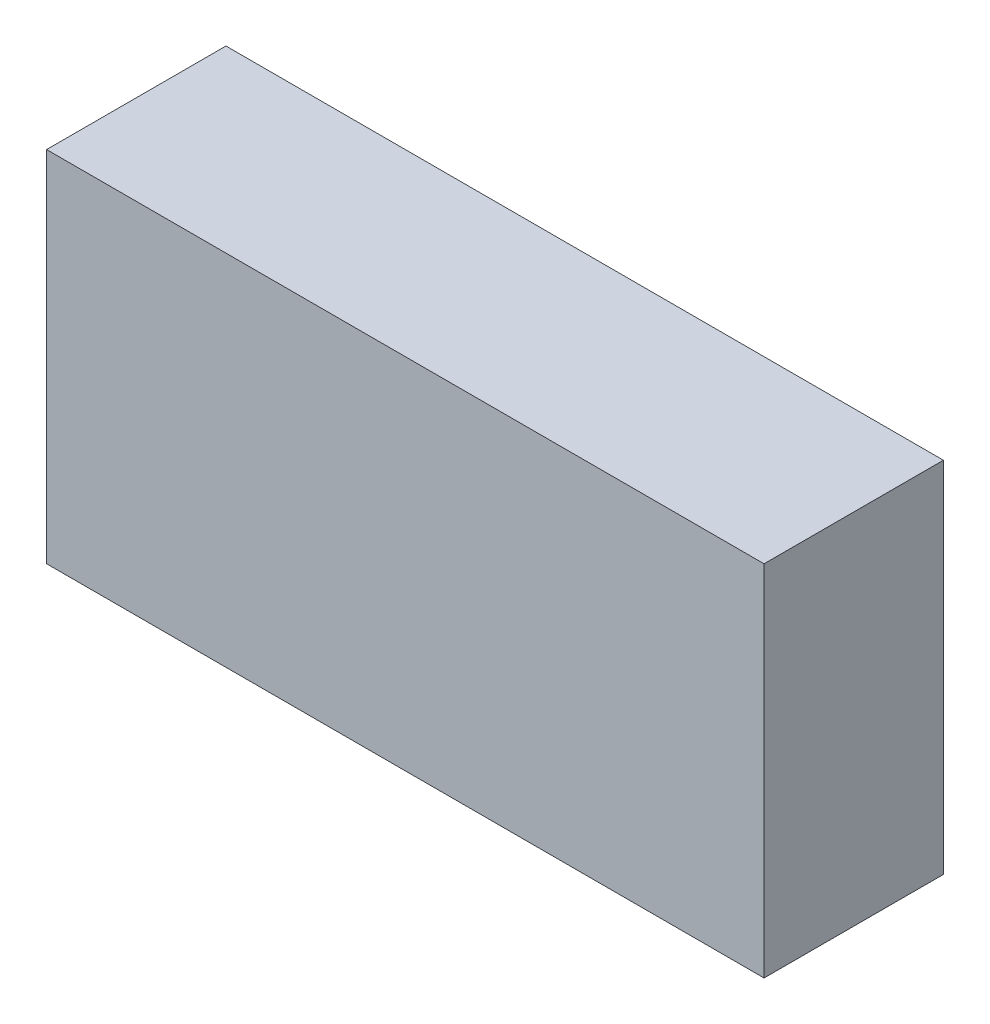
ISO-10303-21;
HEADER;
FILE_DESCRIPTION(('STEP AP214'),'2;1');
FILE_NAME('part.step','',(''),(''),'','','');
FILE_SCHEMA(('AUTOMOTIVE_DESIGN { 1 0 10303 214 1 1 1 1 }'));
ENDSEC;
DATA;
#1=APPLICATION_CONTEXT('core data for automotive mechanical design processes');
#2=APPLICATION_PROTOCOL_DEFINITION('international standard','automotive_design',2000,#1);
#3=PRODUCT_CONTEXT('',#1,'mechanical');
#4=PRODUCT('Part','Part','',(#3));
#5=PRODUCT_RELATED_PRODUCT_CATEGORY('part','',(#4));
#6=PRODUCT_DEFINITION_FORMATION('','',#4);
#7=PRODUCT_DEFINITION_CONTEXT('part definition',#1,'design');
#8=PRODUCT_DEFINITION('design','',#6,#7);
#9=PRODUCT_DEFINITION_SHAPE('','',#8);
#10=(LENGTH_UNIT() NAMED_UNIT(*) SI_UNIT(.MILLI.,.METRE.));
#11=(NAMED_UNIT(*) PLANE_ANGLE_UNIT() SI_UNIT($,.RADIAN.));
#12=(NAMED_UNIT(*) SI_UNIT($,.STERADIAN.) SOLID_ANGLE_UNIT());
#13=UNCERTAINTY_MEASURE_WITH_UNIT(LENGTH_MEASURE(1.E-05),#10,'distance_accuracy_value','');
#14=(GEOMETRIC_REPRESENTATION_CONTEXT(3) GLOBAL_UNCERTAINTY_ASSIGNED_CONTEXT((#13)) GLOBAL_UNIT_ASSIGNED_CONTEXT((#10,
#11,#12)) REPRESENTATION_CONTEXT('',''));
#15=CARTESIAN_POINT('',(0.,0.,0.));
#16=DIRECTION('',(0.,0.,1.));
#17=DIRECTION('',(1.,0.,0.));
#18=AXIS2_PLACEMENT_3D('',#15,#16,#17);
#19=CARTESIAN_POINT('',(-20.,10.,10.));
#20=DIRECTION('',(1.,0.,0.));
#21=DIRECTION('',(0.,0.,-1.));
#22=AXIS2_PLACEMENT_3D('',#19,#20,#21);
#23=PLANE('',#22);
#24=DIRECTION('',(0.,-1.,0.));
#25=VECTOR('',#24,1.);
#26=CARTESIAN_POINT('',(-20.,10.,0.));
#27=LINE('',#26,#25);
#28=CARTESIAN_POINT('',(-20.,10.,0.));
#29=VERTEX_POINT('',#28);
#30=CARTESIAN_POINT('',(-20.,-10.,0.));
#31=VERTEX_POINT('',#30);
#32=EDGE_CURVE('E101',#29,#31,#27,.T.);
#33=ORIENTED_EDGE('',*,*,#32,.T.);
#34=DIRECTION('',(0.,0.,-1.));
#35=VECTOR('',#34,1.);
#36=CARTESIAN_POINT('',(-20.,-10.,10.));
#37=LINE('',#36,#35);
#38=CARTESIAN_POINT('',(-20.,-10.,10.));
#39=VERTEX_POINT('',#38);
#40=EDGE_CURVE('E11',#39,#31,#37,.T.);
#41=ORIENTED_EDGE('',*,*,#40,.F.);
#42=DIRECTION('',(0.,-1.,0.));
#43=VECTOR('',#42,1.);
#44=CARTESIAN_POINT('',(-20.,10.,10.));
#45=LINE('',#44,#43);
#46=CARTESIAN_POINT('',(-20.,10.,10.));
#47=VERTEX_POINT('',#46);
#48=EDGE_CURVE('E95',#47,#39,#45,.T.);
#49=ORIENTED_EDGE('',*,*,#48,.F.);
#50=DIRECTION('',(0.,0.,-1.));
#51=VECTOR('',#50,1.);
#52=CARTESIAN_POINT('',(-20.,10.,10.));
#53=LINE('',#52,#51);
#54=EDGE_CURVE('E99',#47,#29,#53,.T.);
#55=ORIENTED_EDGE('',*,*,#54,.T.);
#56=EDGE_LOOP('',(#33,#41,#49,#55));
#57=FACE_BOUND('',#56,.T.);
#58=ADVANCED_FACE('F41',(#57),#23,.F.);
#59=CARTESIAN_POINT('',(-20.,-10.,10.));
#60=DIRECTION('',(0.,1.,0.));
#61=DIRECTION('',(0.,0.,1.));
#62=AXIS2_PLACEMENT_3D('',#59,#60,#61);
#63=PLANE('',#62);
#64=DIRECTION('',(1.,0.,0.));
#65=VECTOR('',#64,1.);
#66=CARTESIAN_POINT('',(-20.,-10.,0.));
#67=LINE('',#66,#65);
#68=CARTESIAN_POINT('',(20.,-10.,0.));
#69=VERTEX_POINT('',#68);
#70=EDGE_CURVE('E96',#31,#69,#67,.T.);
#71=ORIENTED_EDGE('',*,*,#70,.T.);
#72=DIRECTION('',(0.,0.,-1.));
#73=VECTOR('',#72,1.);
#74=CARTESIAN_POINT('',(20.,-10.,10.));
#75=LINE('',#74,#73);
#76=CARTESIAN_POINT('',(20.,-10.,10.));
#77=VERTEX_POINT('',#76);
#78=EDGE_CURVE('E47',#77,#69,#75,.T.);
#79=ORIENTED_EDGE('',*,*,#78,.F.);
#80=DIRECTION('',(1.,0.,0.));
#81=VECTOR('',#80,1.);
#82=CARTESIAN_POINT('',(-20.,-10.,10.));
#83=LINE('',#82,#81);
#84=EDGE_CURVE('E90',#39,#77,#83,.T.);
#85=ORIENTED_EDGE('',*,*,#84,.F.);
#86=ORIENTED_EDGE('',*,*,#40,.T.);
#87=EDGE_LOOP('',(#71,#79,#85,#86));
#88=FACE_BOUND('',#87,.T.);
#89=ADVANCED_FACE('F94',(#88),#63,.F.);
#90=CARTESIAN_POINT('',(20.,-10.,10.));
#91=DIRECTION('',(-1.,0.,0.));
#92=DIRECTION('',(0.,0.,1.));
#93=AXIS2_PLACEMENT_3D('',#90,#91,#92);
#94=PLANE('',#93);
#95=DIRECTION('',(0.,1.,0.));
#96=VECTOR('',#95,1.);
#97=CARTESIAN_POINT('',(20.,-10.,0.));
#98=LINE('',#97,#96);
#99=CARTESIAN_POINT('',(20.,10.,0.));
#100=VERTEX_POINT('',#99);
#101=EDGE_CURVE('E74',#69,#100,#98,.T.);
#102=ORIENTED_EDGE('',*,*,#101,.T.);
#103=DIRECTION('',(0.,0.,-1.));
#104=VECTOR('',#103,1.);
#105=CARTESIAN_POINT('',(20.,10.,10.));
#106=LINE('',#105,#104);
#107=CARTESIAN_POINT('',(20.,10.,10.));
#108=VERTEX_POINT('',#107);
#109=EDGE_CURVE('E100',#108,#100,#106,.T.);
#110=ORIENTED_EDGE('',*,*,#109,.F.);
#111=DIRECTION('',(0.,1.,0.));
#112=VECTOR('',#111,1.);
#113=CARTESIAN_POINT('',(20.,-10.,10.));
#114=LINE('',#113,#112);
#115=EDGE_CURVE('E89',#77,#108,#114,.T.);
#116=ORIENTED_EDGE('',*,*,#115,.F.);
#117=ORIENTED_EDGE('',*,*,#78,.T.);
#118=EDGE_LOOP('',(#102,#110,#116,#117));
#119=FACE_BOUND('',#118,.T.);
#120=ADVANCED_FACE('F97',(#119),#94,.F.);
#121=CARTESIAN_POINT('',(20.,10.,10.));
#122=DIRECTION('',(0.,-1.,0.));
#123=DIRECTION('',(0.,0.,-1.));
#124=AXIS2_PLACEMENT_3D('',#121,#122,#123);
#125=PLANE('',#124);
#126=DIRECTION('',(-1.,0.,0.));
#127=VECTOR('',#126,1.);
#128=CARTESIAN_POINT('',(20.,10.,0.));
#129=LINE('',#128,#127);
#130=EDGE_CURVE('E79',#100,#29,#129,.T.);
#131=ORIENTED_EDGE('',*,*,#130,.T.);
#132=ORIENTED_EDGE('',*,*,#54,.F.);
#133=DIRECTION('',(-1.,0.,0.));
#134=VECTOR('',#133,1.);
#135=CARTESIAN_POINT('',(20.,10.,10.));
#136=LINE('',#135,#134);
#137=EDGE_CURVE('E60',#108,#47,#136,.T.);
#138=ORIENTED_EDGE('',*,*,#137,.F.);
#139=ORIENTED_EDGE('',*,*,#109,.T.);
#140=EDGE_LOOP('',(#131,#132,#138,#139));
#141=FACE_BOUND('',#140,.T.);
#142=ADVANCED_FACE('F112',(#141),#125,.F.);
#143=CARTESIAN_POINT('',(0.,0.,10.));
#144=DIRECTION('',(0.,0.,1.));
#145=DIRECTION('',(1.,0.,0.));
#146=AXIS2_PLACEMENT_3D('',#143,#144,#145);
#147=PLANE('',#146);
#148=ORIENTED_EDGE('',*,*,#48,.T.);
#149=ORIENTED_EDGE('',*,*,#84,.T.);
#150=ORIENTED_EDGE('',*,*,#115,.T.);
#151=ORIENTED_EDGE('',*,*,#137,.T.);
#152=EDGE_LOOP('',(#148,#149,#150,#151));
#153=FACE_BOUND('',#152,.T.);
#154=ADVANCED_FACE('F88',(#153),#147,.T.);
#155=CARTESIAN_POINT('',(0.,0.,0.));
#156=DIRECTION('',(0.,0.,1.));
#157=DIRECTION('',(1.,0.,0.));
#158=AXIS2_PLACEMENT_3D('',#155,#156,#157);
#159=PLANE('',#158);
#160=ORIENTED_EDGE('',*,*,#32,.F.);
#161=ORIENTED_EDGE('',*,*,#130,.F.);
#162=ORIENTED_EDGE('',*,*,#101,.F.);
#163=ORIENTED_EDGE('',*,*,#70,.F.);
#164=EDGE_LOOP('',(#160,#161,#162,#163));
#165=FACE_BOUND('',#164,.T.);
#166=ADVANCED_FACE('F114',(#165),#159,.F.);
#167=CLOSED_SHELL('',(#58,#89,#120,#142,#154,#166));
#168=MANIFOLD_SOLID_BREP('B2',#167);
#169=ADVANCED_BREP_SHAPE_REPRESENTATION('',(#18,#168),#14);
#170=SHAPE_DEFINITION_REPRESENTATION(#9,#169);
ENDSEC;
END-ISO-10303-21;
